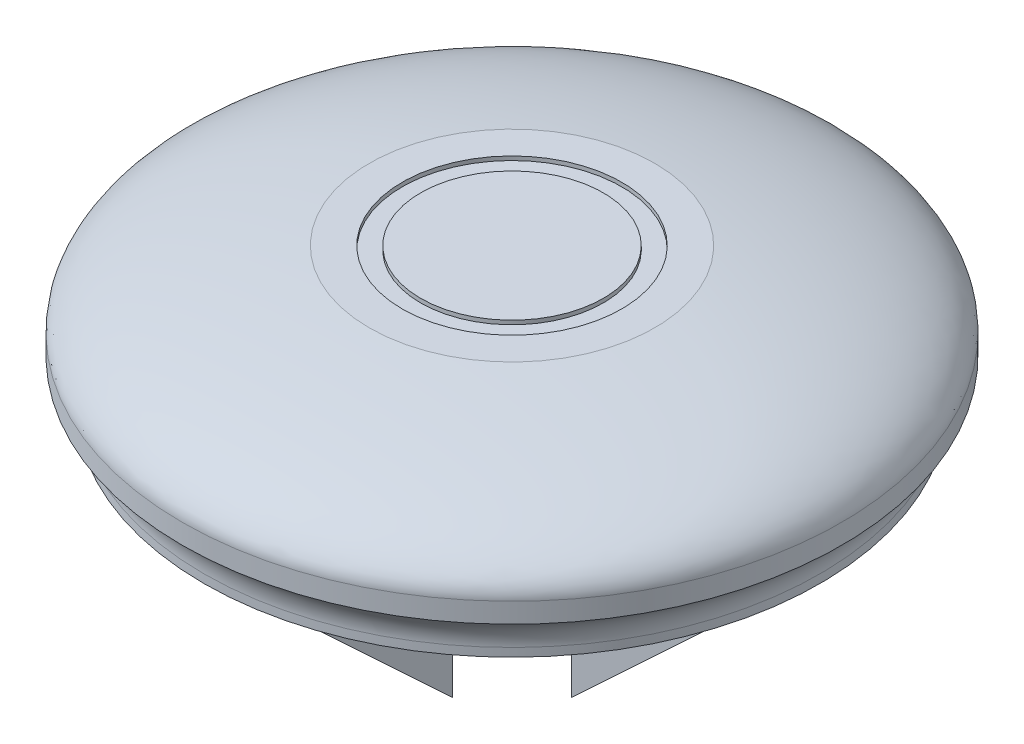
ISO-10303-21;
HEADER;
FILE_DESCRIPTION(('STEP AP214'),'2;1');
FILE_NAME('part.step','',(''),(''),'','','');
FILE_SCHEMA(('AUTOMOTIVE_DESIGN { 1 0 10303 214 1 1 1 1 }'));
ENDSEC;
DATA;
#1=APPLICATION_CONTEXT('core data for automotive mechanical design processes');
#2=APPLICATION_PROTOCOL_DEFINITION('international standard','automotive_design',2000,#1);
#3=PRODUCT_CONTEXT('',#1,'mechanical');
#4=PRODUCT('Part','Part','',(#3));
#5=PRODUCT_RELATED_PRODUCT_CATEGORY('part','',(#4));
#6=PRODUCT_DEFINITION_FORMATION('','',#4);
#7=PRODUCT_DEFINITION_CONTEXT('part definition',#1,'design');
#8=PRODUCT_DEFINITION('design','',#6,#7);
#9=PRODUCT_DEFINITION_SHAPE('','',#8);
#10=(LENGTH_UNIT() NAMED_UNIT(*) SI_UNIT(.MILLI.,.METRE.));
#11=(NAMED_UNIT(*) PLANE_ANGLE_UNIT() SI_UNIT($,.RADIAN.));
#12=(NAMED_UNIT(*) SI_UNIT($,.STERADIAN.) SOLID_ANGLE_UNIT());
#13=UNCERTAINTY_MEASURE_WITH_UNIT(LENGTH_MEASURE(1.E-05),#10,'distance_accuracy_value','');
#14=(GEOMETRIC_REPRESENTATION_CONTEXT(3) GLOBAL_UNCERTAINTY_ASSIGNED_CONTEXT((#13)) GLOBAL_UNIT_ASSIGNED_CONTEXT((#10,
#11,#12)) REPRESENTATION_CONTEXT('',''));
#15=CARTESIAN_POINT('',(0.,0.,0.));
#16=DIRECTION('',(0.,0.,1.));
#17=DIRECTION('',(1.,0.,0.));
#18=AXIS2_PLACEMENT_3D('',#15,#16,#17);
#19=CARTESIAN_POINT('',(-49.9437478871734,-11.,23.4419821017126));
#20=DIRECTION('',(0.,-1.,0.));
#21=DIRECTION('',(0.,0.,-1.));
#22=AXIS2_PLACEMENT_3D('',#19,#20,#21);
#23=PLANE('',#22);
#24=CARTESIAN_POINT('',(-49.9437478871734,-11.,23.4419821017126));
#25=DIRECTION('',(0.,-1.,0.));
#26=DIRECTION('',(0.,0.,-1.));
#27=AXIS2_PLACEMENT_3D('',#24,#25,#26);
#28=CIRCLE('',#27,77.4335917291096);
#29=CARTESIAN_POINT('',(-49.9437478871734,-11.,100.875573830822));
#30=VERTEX_POINT('',#29);
#31=EDGE_CURVE('E195',#30,#30,#28,.T.);
#32=ORIENTED_EDGE('',*,*,#31,.T.);
#33=EDGE_LOOP('',(#32));
#34=FACE_BOUND('',#33,.T.);
#35=DIRECTION('',(1.,0.,0.));
#36=VECTOR('',#35,1.);
#37=CARTESIAN_POINT('',(-39.9437478871726,-11.,-50.8883616348798));
#38=LINE('',#37,#36);
#39=CARTESIAN_POINT('',(-59.9437478871726,-11.,-50.88836163488));
#40=VERTEX_POINT('',#39);
#41=CARTESIAN_POINT('',(-39.9437478871726,-11.,-50.8883616348798));
#42=VERTEX_POINT('',#41);
#43=EDGE_CURVE('E180',#40,#42,#38,.T.);
#44=ORIENTED_EDGE('',*,*,#43,.F.);
#45=CARTESIAN_POINT('',(-49.9437478871734,-11.,23.4419821017126));
#46=DIRECTION('',(0.,-1.,0.));
#47=DIRECTION('',(0.,0.,-1.));
#48=AXIS2_PLACEMENT_3D('',#45,#46,#47);
#49=CIRCLE('',#48,75.);
#50=CARTESIAN_POINT('',(-124.274091623766,-11.,13.4419821017126));
#51=VERTEX_POINT('',#50);
#52=EDGE_CURVE('E174',#51,#40,#49,.T.);
#53=ORIENTED_EDGE('',*,*,#52,.F.);
#54=DIRECTION('',(0.,0.,-1.));
#55=VECTOR('',#54,1.);
#56=CARTESIAN_POINT('',(-124.274091623766,-11.,13.4419821017126));
#57=LINE('',#56,#55);
#58=CARTESIAN_POINT('',(-124.274091623766,-11.,33.4419821017126));
#59=VERTEX_POINT('',#58);
#60=EDGE_CURVE('E143',#59,#51,#57,.T.);
#61=ORIENTED_EDGE('',*,*,#60,.F.);
#62=CARTESIAN_POINT('',(-49.9437478871734,-11.,23.4419821017126));
#63=DIRECTION('',(0.,-1.,0.));
#64=DIRECTION('',(0.,0.,-1.));
#65=AXIS2_PLACEMENT_3D('',#62,#63,#64);
#66=CIRCLE('',#65,75.);
#67=CARTESIAN_POINT('',(-59.9437478871736,-11.,97.7723258383051));
#68=VERTEX_POINT('',#67);
#69=EDGE_CURVE('E183',#68,#59,#66,.T.);
#70=ORIENTED_EDGE('',*,*,#69,.F.);
#71=DIRECTION('',(-1.,0.,0.));
#72=VECTOR('',#71,1.);
#73=CARTESIAN_POINT('',(-59.9437478871736,-11.,97.7723258383051));
#74=LINE('',#73,#72);
#75=CARTESIAN_POINT('',(-39.9437478871736,-11.,97.7723258383052));
#76=VERTEX_POINT('',#75);
#77=EDGE_CURVE('E399',#76,#68,#74,.T.);
#78=ORIENTED_EDGE('',*,*,#77,.F.);
#79=CARTESIAN_POINT('',(-49.9437478871734,-11.,23.4419821017126));
#80=DIRECTION('',(0.,-1.,0.));
#81=DIRECTION('',(0.,0.,-1.));
#82=AXIS2_PLACEMENT_3D('',#79,#80,#81);
#83=CIRCLE('',#82,75.);
#84=CARTESIAN_POINT('',(24.3865958494191,-11.,33.4419821017126));
#85=VERTEX_POINT('',#84);
#86=EDGE_CURVE('E186',#85,#76,#83,.T.);
#87=ORIENTED_EDGE('',*,*,#86,.F.);
#88=DIRECTION('',(0.,0.,1.));
#89=VECTOR('',#88,1.);
#90=CARTESIAN_POINT('',(24.3865958494191,-11.,33.4419821017126));
#91=LINE('',#90,#89);
#92=CARTESIAN_POINT('',(24.3865958494191,-11.,13.4419821017126));
#93=VERTEX_POINT('',#92);
#94=EDGE_CURVE('E408',#93,#85,#91,.T.);
#95=ORIENTED_EDGE('',*,*,#94,.F.);
#96=CARTESIAN_POINT('',(-49.9437478871734,-11.,23.4419821017126));
#97=DIRECTION('',(0.,-1.,0.));
#98=DIRECTION('',(0.,0.,-1.));
#99=AXIS2_PLACEMENT_3D('',#96,#97,#98);
#100=CIRCLE('',#99,75.);
#101=EDGE_CURVE('E182',#42,#93,#100,.T.);
#102=ORIENTED_EDGE('',*,*,#101,.F.);
#103=EDGE_LOOP('',(#44,#53,#61,#70,#78,#87,#95,#102));
#104=FACE_BOUND('',#103,.T.);
#105=ADVANCED_FACE('F33',(#34,#104),#23,.T.);
#106=CARTESIAN_POINT('',(-49.9437478871734,5.,23.4419821017126));
#107=DIRECTION('',(0.,-1.,0.));
#108=DIRECTION('',(0.,0.,-1.));
#109=AXIS2_PLACEMENT_3D('',#106,#107,#108);
#110=CYLINDRICAL_SURFACE('',#109,82.8321698610159);
#111=CARTESIAN_POINT('',(-49.9437478871734,5.,23.4419821017126));
#112=DIRECTION('',(0.,1.,0.));
#113=DIRECTION('',(0.,0.,1.));
#114=AXIS2_PLACEMENT_3D('',#111,#112,#113);
#115=CIRCLE('',#114,82.8321698610159);
#116=CARTESIAN_POINT('',(-49.9437478871734,5.,106.274151962729));
#117=VERTEX_POINT('',#116);
#118=EDGE_CURVE('E41',#117,#117,#115,.T.);
#119=ORIENTED_EDGE('',*,*,#118,.F.);
#120=EDGE_LOOP('',(#119));
#121=FACE_BOUND('',#120,.T.);
#122=CARTESIAN_POINT('',(-49.9437478871734,0.,23.4419821017126));
#123=DIRECTION('',(0.,1.,0.));
#124=DIRECTION('',(0.,0.,1.));
#125=AXIS2_PLACEMENT_3D('',#122,#123,#124);
#126=CIRCLE('',#125,82.8321698610159);
#127=CARTESIAN_POINT('',(-49.9437478871734,0.,106.274151962729));
#128=VERTEX_POINT('',#127);
#129=EDGE_CURVE('E298',#128,#128,#126,.T.);
#130=ORIENTED_EDGE('',*,*,#129,.T.);
#131=EDGE_LOOP('',(#130));
#132=FACE_BOUND('',#131,.T.);
#133=ADVANCED_FACE('F220',(#121,#132),#110,.T.);
#134=CARTESIAN_POINT('',(-49.9437478871734,5.,23.4419821017126));
#135=DIRECTION('',(0.,0.,1.));
#136=DIRECTION('',(1.,0.,0.));
#137=AXIS2_PLACEMENT_3D('',#134,#135,#136);
#138=ELLIPSE('',#137,82.8321698610159,20.9109413690646);
#139=TRIMMED_CURVE('',#138,(PARAMETER_VALUE(-1.5707963267949)),
(PARAMETER_VALUE(1.5707963267949)),.T.,.PARAMETER.);
#140=CARTESIAN_POINT('',(-49.9437478871734,5.,23.4419821017126));
#141=DIRECTION('',(0.,-1.,0.));
#142=AXIS1_PLACEMENT('',#140,#141);
#143=SURFACE_OF_REVOLUTION('',#139,#142);
#144=CARTESIAN_POINT('',(-49.9437478871734,23.850888377349,23.4419821017126));
#145=DIRECTION('',(0.,-1.,0.));
#146=DIRECTION('',(0.,0.,-1.));
#147=AXIS2_PLACEMENT_3D('',#144,#145,#146);
#148=CIRCLE('',#147,35.8507157476907);
#149=CARTESIAN_POINT('',(-49.9437478871734,23.850888377349,-12.4087336459781));
#150=VERTEX_POINT('',#149);
#151=EDGE_CURVE('E208',#150,#150,#148,.F.);
#152=ORIENTED_EDGE('',*,*,#151,.F.);
#153=EDGE_LOOP('',(#152));
#154=FACE_BOUND('',#153,.T.);
#155=ORIENTED_EDGE('',*,*,#118,.T.);
#156=EDGE_LOOP('',(#155));
#157=FACE_BOUND('',#156,.T.);
#158=ADVANCED_FACE('F215',(#154,#157),#143,.F.);
#159=CARTESIAN_POINT('',(-96.5273513238363,23.850888377349,-51.5580178982874));
#160=DIRECTION('',(0.,-1.,0.));
#161=DIRECTION('',(0.,0.,-1.));
#162=AXIS2_PLACEMENT_3D('',#159,#160,#161);
#163=PLANE('',#162);
#164=CARTESIAN_POINT('',(-49.9437478871734,23.850888377349,23.4419821017126));
#165=DIRECTION('',(0.,1.,0.));
#166=DIRECTION('',(0.,0.,1.));
#167=AXIS2_PLACEMENT_3D('',#164,#165,#166);
#168=CIRCLE('',#167,27.5983496815975);
#169=CARTESIAN_POINT('',(-49.9437478871734,23.850888377349,51.0403317833101));
#170=VERTEX_POINT('',#169);
#171=EDGE_CURVE('E202',#170,#170,#168,.T.);
#172=ORIENTED_EDGE('',*,*,#171,.F.);
#173=EDGE_LOOP('',(#172));
#174=FACE_BOUND('',#173,.T.);
#175=ORIENTED_EDGE('',*,*,#151,.T.);
#176=EDGE_LOOP('',(#175));
#177=FACE_BOUND('',#176,.T.);
#178=ADVANCED_FACE('F219',(#174,#177),#163,.F.);
#179=CARTESIAN_POINT('',(-49.9437478871734,22.850888377349,23.4419821017126));
#180=DIRECTION('',(0.,1.,0.));
#181=DIRECTION('',(0.,0.,1.));
#182=AXIS2_PLACEMENT_3D('',#179,#180,#181);
#183=CYLINDRICAL_SURFACE('',#182,27.5983496815975);
#184=CARTESIAN_POINT('',(-49.9437478871734,22.850888377349,23.4419821017126));
#185=DIRECTION('',(0.,1.,0.));
#186=DIRECTION('',(0.,0.,1.));
#187=AXIS2_PLACEMENT_3D('',#184,#185,#186);
#188=CIRCLE('',#187,27.5983496815975);
#189=CARTESIAN_POINT('',(-49.9437478871734,22.850888377349,51.0403317833101));
#190=VERTEX_POINT('',#189);
#191=EDGE_CURVE('E205',#190,#190,#188,.T.);
#192=ORIENTED_EDGE('',*,*,#191,.F.);
#193=EDGE_LOOP('',(#192));
#194=FACE_BOUND('',#193,.T.);
#195=ORIENTED_EDGE('',*,*,#171,.T.);
#196=EDGE_LOOP('',(#195));
#197=FACE_BOUND('',#196,.T.);
#198=ADVANCED_FACE('F451',(#194,#197),#183,.F.);
#199=CARTESIAN_POINT('',(-49.9437478871734,22.850888377349,23.4419821017126));
#200=DIRECTION('',(0.,1.,0.));
#201=DIRECTION('',(0.,0.,1.));
#202=AXIS2_PLACEMENT_3D('',#199,#200,#201);
#203=PLANE('',#202);
#204=CARTESIAN_POINT('',(-49.9437478871734,22.850888377349,23.4419821017126));
#205=DIRECTION('',(0.,1.,0.));
#206=DIRECTION('',(0.,0.,1.));
#207=AXIS2_PLACEMENT_3D('',#204,#205,#206);
#208=CIRCLE('',#207,22.9729279472515);
#209=CARTESIAN_POINT('',(-49.9437478871734,22.850888377349,46.4149100489641));
#210=VERTEX_POINT('',#209);
#211=EDGE_CURVE('E199',#210,#210,#208,.T.);
#212=ORIENTED_EDGE('',*,*,#211,.F.);
#213=EDGE_LOOP('',(#212));
#214=FACE_BOUND('',#213,.T.);
#215=ORIENTED_EDGE('',*,*,#191,.T.);
#216=EDGE_LOOP('',(#215));
#217=FACE_BOUND('',#216,.T.);
#218=ADVANCED_FACE('F448',(#214,#217),#203,.T.);
#219=CARTESIAN_POINT('',(-49.9437478871734,22.850888377349,23.4419821017126));
#220=DIRECTION('',(0.,1.,0.));
#221=DIRECTION('',(0.,0.,1.));
#222=AXIS2_PLACEMENT_3D('',#219,#220,#221);
#223=CYLINDRICAL_SURFACE('',#222,22.9729279472515);
#224=ORIENTED_EDGE('',*,*,#211,.T.);
#225=EDGE_LOOP('',(#224));
#226=FACE_BOUND('',#225,.T.);
#227=CARTESIAN_POINT('',(-49.9437478871734,23.850888377349,23.4419821017126));
#228=DIRECTION('',(0.,1.,0.));
#229=DIRECTION('',(0.,0.,1.));
#230=AXIS2_PLACEMENT_3D('',#227,#228,#229);
#231=CIRCLE('',#230,22.9729279472515);
#232=CARTESIAN_POINT('',(-49.9437478871734,23.850888377349,46.4149100489641));
#233=VERTEX_POINT('',#232);
#234=EDGE_CURVE('E198',#233,#233,#231,.T.);
#235=ORIENTED_EDGE('',*,*,#234,.F.);
#236=EDGE_LOOP('',(#235));
#237=FACE_BOUND('',#236,.T.);
#238=ADVANCED_FACE('F445',(#226,#237),#223,.T.);
#239=ORIENTED_EDGE('',*,*,#234,.T.);
#240=EDGE_LOOP('',(#239));
#241=FACE_BOUND('',#240,.T.);
#242=ADVANCED_FACE('F443',(#241),#163,.F.);
#243=CARTESIAN_POINT('',(-49.9437478871734,-11.,23.4419821017126));
#244=DIRECTION('',(0.,1.,0.));
#245=DIRECTION('',(0.,0.,1.));
#246=AXIS2_PLACEMENT_3D('',#243,#244,#245);
#247=CYLINDRICAL_SURFACE('',#246,77.4335917291096);
#248=CARTESIAN_POINT('',(-49.9437478871734,-8.87845238720293,23.4419821017126));
#249=DIRECTION('',(0.,1.,0.));
#250=DIRECTION('',(0.,0.,1.));
#251=AXIS2_PLACEMENT_3D('',#248,#249,#250);
#252=CIRCLE('',#251,77.4335917291096);
#253=CARTESIAN_POINT('',(-49.9437478871734,-8.87845238720293,100.875573830822));
#254=VERTEX_POINT('',#253);
#255=EDGE_CURVE('E11',#254,#254,#252,.F.);
#256=CARTESIAN_POINT('',(-49.9437478871734,-8.87845238720293,100.875573830822));
#257=CARTESIAN_POINT('',(-49.9437478871734,-8.9005518415029,100.875573830822));
#258=CARTESIAN_POINT('',(-49.9437478871734,-8.92265129580286,100.875573830822));
#259=CARTESIAN_POINT('',(-49.9437478871734,-8.9668502044028,100.875573830822));
#260=CARTESIAN_POINT('',(-49.9437478871734,-8.98894965870277,100.875573830822));
#261=CARTESIAN_POINT('',(-49.9437478871734,-9.03314856730271,100.875573830822));
#262=CARTESIAN_POINT('',(-49.9437478871734,-9.05524802160268,100.875573830822));
#263=CARTESIAN_POINT('',(-49.9437478871734,-9.09944693020262,100.875573830822));
#264=CARTESIAN_POINT('',(-49.9437478871734,-9.12154638450259,100.875573830822));
#265=CARTESIAN_POINT('',(-49.9437478871734,-9.16574529310253,100.875573830822));
#266=CARTESIAN_POINT('',(-49.9437478871734,-9.1878447474025,100.875573830822));
#267=CARTESIAN_POINT('',(-49.9437478871734,-9.23204365600244,100.875573830822));
#268=CARTESIAN_POINT('',(-49.9437478871734,-9.25414311030241,100.875573830822));
#269=CARTESIAN_POINT('',(-49.9437478871734,-9.29834201890235,100.875573830822));
#270=CARTESIAN_POINT('',(-49.9437478871734,-9.32044147320232,100.875573830822));
#271=CARTESIAN_POINT('',(-49.9437478871734,-9.36464038180226,100.875573830822));
#272=CARTESIAN_POINT('',(-49.9437478871734,-9.38673983610223,100.875573830822));
#273=CARTESIAN_POINT('',(-49.9437478871734,-9.43093874470217,100.875573830822));
#274=CARTESIAN_POINT('',(-49.9437478871734,-9.45303819900214,100.875573830822));
#275=CARTESIAN_POINT('',(-49.9437478871734,-9.49723710760208,100.875573830822));
#276=CARTESIAN_POINT('',(-49.9437478871734,-9.51933656190205,100.875573830822));
#277=CARTESIAN_POINT('',(-49.9437478871734,-9.56353547050199,100.875573830822));
#278=CARTESIAN_POINT('',(-49.9437478871734,-9.58563492480195,100.875573830822));
#279=CARTESIAN_POINT('',(-49.9437478871734,-9.62983383340189,100.875573830822));
#280=CARTESIAN_POINT('',(-49.9437478871734,-9.65193328770186,100.875573830822));
#281=CARTESIAN_POINT('',(-49.9437478871734,-9.6961321963018,100.875573830822));
#282=CARTESIAN_POINT('',(-49.9437478871734,-9.71823165060177,100.875573830822));
#283=CARTESIAN_POINT('',(-49.9437478871734,-9.76243055920171,100.875573830822));
#284=CARTESIAN_POINT('',(-49.9437478871734,-9.78453001350168,100.875573830822));
#285=CARTESIAN_POINT('',(-49.9437478871734,-9.82872892210162,100.875573830822));
#286=CARTESIAN_POINT('',(-49.9437478871734,-9.85082837640159,100.875573830822));
#287=CARTESIAN_POINT('',(-49.9437478871734,-9.89502728500153,100.875573830822));
#288=CARTESIAN_POINT('',(-49.9437478871734,-9.9171267393015,100.875573830822));
#289=CARTESIAN_POINT('',(-49.9437478871734,-9.96132564790144,100.875573830822));
#290=CARTESIAN_POINT('',(-49.9437478871734,-9.98342510220141,100.875573830822));
#291=CARTESIAN_POINT('',(-49.9437478871734,-10.0276240108013,100.875573830822));
#292=CARTESIAN_POINT('',(-49.9437478871734,-10.0497234651013,100.875573830822));
#293=CARTESIAN_POINT('',(-49.9437478871734,-10.0939223737013,100.875573830822));
#294=CARTESIAN_POINT('',(-49.9437478871734,-10.1160218280012,100.875573830822));
#295=CARTESIAN_POINT('',(-49.9437478871734,-10.1602207366012,100.875573830822));
#296=CARTESIAN_POINT('',(-49.9437478871734,-10.1823201909011,100.875573830822));
#297=CARTESIAN_POINT('',(-49.9437478871734,-10.2265190995011,100.875573830822));
#298=CARTESIAN_POINT('',(-49.9437478871734,-10.248618553801,100.875573830822));
#299=CARTESIAN_POINT('',(-49.9437478871734,-10.292817462401,100.875573830822));
#300=CARTESIAN_POINT('',(-49.9437478871734,-10.314916916701,100.875573830822));
#301=CARTESIAN_POINT('',(-49.9437478871734,-10.3591158253009,100.875573830822));
#302=CARTESIAN_POINT('',(-49.9437478871734,-10.3812152796009,100.875573830822));
#303=CARTESIAN_POINT('',(-49.9437478871734,-10.4254141882008,100.875573830822));
#304=CARTESIAN_POINT('',(-49.9437478871734,-10.4475136425008,100.875573830822));
#305=CARTESIAN_POINT('',(-49.9437478871734,-10.4917125511007,100.875573830822));
#306=CARTESIAN_POINT('',(-49.9437478871734,-10.5138120054007,100.875573830822));
#307=CARTESIAN_POINT('',(-49.9437478871734,-10.5580109140006,100.875573830822));
#308=CARTESIAN_POINT('',(-49.9437478871734,-10.5801103683006,100.875573830822));
#309=CARTESIAN_POINT('',(-49.9437478871734,-10.6243092769005,100.875573830822));
#310=CARTESIAN_POINT('',(-49.9437478871734,-10.6464087312005,100.875573830822));
#311=CARTESIAN_POINT('',(-49.9437478871734,-10.6906076398004,100.875573830822));
#312=CARTESIAN_POINT('',(-49.9437478871734,-10.7127070941004,100.875573830822));
#313=CARTESIAN_POINT('',(-49.9437478871734,-10.7569060027003,100.875573830822));
#314=CARTESIAN_POINT('',(-49.9437478871734,-10.7790054570003,100.875573830822));
#315=CARTESIAN_POINT('',(-49.9437478871734,-10.8232043656003,100.875573830822));
#316=CARTESIAN_POINT('',(-49.9437478871734,-10.8453038199002,100.875573830822));
#317=CARTESIAN_POINT('',(-49.9437478871734,-10.8895027285002,100.875573830822));
#318=CARTESIAN_POINT('',(-49.9437478871734,-10.9116021828001,100.875573830822));
#319=CARTESIAN_POINT('',(-49.9437478871734,-10.9558010914001,100.875573830822));
#320=CARTESIAN_POINT('',(-49.9437478871734,-10.9779005457,100.875573830822));
#321=CARTESIAN_POINT('',(-49.9437478871734,-11.,100.875573830822));
#322=B_SPLINE_CURVE_WITH_KNOTS('',3,(#256,#257,#258,#259,#260,#261,#262,#263,#264,#265,#266,
#267,#268,#269,#270,#271,#272,#273,#274,#275,#276,#277,#278,#279,#280,#281,#282,#283,#284,#285,
#286,#287,#288,#289,#290,#291,#292,#293,#294,#295,#296,#297,#298,#299,#300,#301,#302,#303,#304,
#305,#306,#307,#308,#309,#310,#311,#312,#313,#314,#315,#316,#317,#318,#319,#320,#321),
.UNSPECIFIED.,.F.,.F.,(4,2,2,2,2,2,2,2,2,2,2,2,2,2,2,2,2,2,2,2,2,2,2,2,2,2,2,2,2,2,2,2,4),(0.,
0.0662983628999091,0.132596725799817,0.198895088699726,0.265193451599635,0.331491814499544,
0.397790177399453,0.464088540299362,0.530386903199271,0.59668526609918,0.66298362899909,
0.729281991898999,0.795580354798908,0.861878717698815,0.928177080598724,0.994475443498633,
1.06077380639854,1.12707216929845,1.19337053219836,1.25966889509827,1.32596725799818,
1.39226562089809,1.458563983798,1.5248623466979,1.59116070959781,1.65745907249772,
1.72375743539763,1.79005579829754,1.85635416119745,1.92265252409736,1.98895088699727,
2.05524924989718,2.12154761279709),.UNSPECIFIED.);
#323=EDGE_CURVE('BSEAM227',#254,#30,#322,.T.);
#324=ORIENTED_EDGE('',*,*,#255,.T.);
#325=ORIENTED_EDGE('',*,*,#31,.F.);
#326=ORIENTED_EDGE('',*,*,#323,.T.);
#327=ORIENTED_EDGE('',*,*,#323,.F.);
#328=EDGE_LOOP('',(#324,#326,#325,#327));
#329=FACE_BOUND('',#328,.T.);
#330=ADVANCED_FACE('F227',(#329),#247,.T.);
#331=CARTESIAN_POINT('',(-49.9437478871734,5.,23.4419821017126));
#332=DIRECTION('',(0.,-1.,0.));
#333=DIRECTION('',(0.,0.,-1.));
#334=AXIS2_PLACEMENT_3D('',#331,#332,#333);
#335=PLANE('',#334);
#336=DIRECTION('',(-1.,0.,0.));
#337=VECTOR('',#336,1.);
#338=CARTESIAN_POINT('',(-59.9437478871734,5.,-1.5580178982874));
#339=LINE('',#338,#337);
#340=CARTESIAN_POINT('',(-39.9437478871734,5.,-1.5580178982874));
#341=VERTEX_POINT('',#340);
#342=CARTESIAN_POINT('',(-59.9437478871734,5.,-1.5580178982874));
#343=VERTEX_POINT('',#342);
#344=EDGE_CURVE('E53',#341,#343,#339,.T.);
#345=ORIENTED_EDGE('',*,*,#344,.F.);
#346=DIRECTION('',(0.,0.,1.));
#347=VECTOR('',#346,1.);
#348=CARTESIAN_POINT('',(-39.9437478871734,5.,-50.8883616348799));
#349=LINE('',#348,#347);
#350=CARTESIAN_POINT('',(-39.9437478871734,5.,-50.8883616348799));
#351=VERTEX_POINT('',#350);
#352=EDGE_CURVE('E48',#351,#341,#349,.T.);
#353=ORIENTED_EDGE('',*,*,#352,.F.);
#354=CARTESIAN_POINT('',(-49.9437478871734,5.,23.4419821017126));
#355=DIRECTION('',(0.,1.,0.));
#356=DIRECTION('',(0.,0.,1.));
#357=AXIS2_PLACEMENT_3D('',#354,#355,#356);
#358=CIRCLE('',#357,75.);
#359=CARTESIAN_POINT('',(24.3865958494191,5.,13.4419821017126));
#360=VERTEX_POINT('',#359);
#361=EDGE_CURVE('E350',#360,#351,#358,.T.);
#362=ORIENTED_EDGE('',*,*,#361,.F.);
#363=DIRECTION('',(1.,0.,0.));
#364=VECTOR('',#363,1.);
#365=CARTESIAN_POINT('',(24.3865958494191,5.,13.4419821017126));
#366=LINE('',#365,#364);
#367=CARTESIAN_POINT('',(-24.9437478871734,5.,13.4419821017126));
#368=VERTEX_POINT('',#367);
#369=EDGE_CURVE('E347',#368,#360,#366,.T.);
#370=ORIENTED_EDGE('',*,*,#369,.F.);
#371=DIRECTION('',(0.,0.,-1.));
#372=VECTOR('',#371,1.);
#373=CARTESIAN_POINT('',(-24.9437478871734,5.,13.4419821017126));
#374=LINE('',#373,#372);
#375=CARTESIAN_POINT('',(-24.9437478871734,5.,33.4419821017126));
#376=VERTEX_POINT('',#375);
#377=EDGE_CURVE('E344',#376,#368,#374,.T.);
#378=ORIENTED_EDGE('',*,*,#377,.F.);
#379=DIRECTION('',(-1.,0.,0.));
#380=VECTOR('',#379,1.);
#381=CARTESIAN_POINT('',(24.3865958494191,5.,33.4419821017126));
#382=LINE('',#381,#380);
#383=CARTESIAN_POINT('',(24.3865958494192,5.,33.4419821017126));
#384=VERTEX_POINT('',#383);
#385=EDGE_CURVE('E341',#384,#376,#382,.T.);
#386=ORIENTED_EDGE('',*,*,#385,.F.);
#387=CARTESIAN_POINT('',(-49.9437478871734,5.,23.4419821017126));
#388=DIRECTION('',(0.,1.,0.));
#389=DIRECTION('',(0.,0.,1.));
#390=AXIS2_PLACEMENT_3D('',#387,#388,#389);
#391=CIRCLE('',#390,75.);
#392=CARTESIAN_POINT('',(-39.9437478871734,5.,97.7723258383051));
#393=VERTEX_POINT('',#392);
#394=EDGE_CURVE('E338',#393,#384,#391,.T.);
#395=ORIENTED_EDGE('',*,*,#394,.F.);
#396=DIRECTION('',(0.,0.,1.));
#397=VECTOR('',#396,1.);
#398=CARTESIAN_POINT('',(-39.9437478871734,5.,97.7723258383051));
#399=LINE('',#398,#397);
#400=CARTESIAN_POINT('',(-39.9437478871734,5.,48.4419821017126));
#401=VERTEX_POINT('',#400);
#402=EDGE_CURVE('E335',#401,#393,#399,.T.);
#403=ORIENTED_EDGE('',*,*,#402,.F.);
#404=DIRECTION('',(1.,0.,0.));
#405=VECTOR('',#404,1.);
#406=CARTESIAN_POINT('',(-39.9437478871734,5.,48.4419821017126));
#407=LINE('',#406,#405);
#408=CARTESIAN_POINT('',(-59.9437478871734,5.,48.4419821017126));
#409=VERTEX_POINT('',#408);
#410=EDGE_CURVE('E332',#409,#401,#407,.T.);
#411=ORIENTED_EDGE('',*,*,#410,.F.);
#412=DIRECTION('',(0.,0.,-1.));
#413=VECTOR('',#412,1.);
#414=CARTESIAN_POINT('',(-59.9437478871734,5.,97.7723258383051));
#415=LINE('',#414,#413);
#416=CARTESIAN_POINT('',(-59.9437478871734,5.,97.7723258383051));
#417=VERTEX_POINT('',#416);
#418=EDGE_CURVE('E329',#417,#409,#415,.T.);
#419=ORIENTED_EDGE('',*,*,#418,.F.);
#420=CARTESIAN_POINT('',(-49.9437478871734,5.,23.4419821017126));
#421=DIRECTION('',(0.,1.,0.));
#422=DIRECTION('',(0.,0.,1.));
#423=AXIS2_PLACEMENT_3D('',#420,#421,#422);
#424=CIRCLE('',#423,75.);
#425=CARTESIAN_POINT('',(-124.274091623766,5.,33.4419821017126));
#426=VERTEX_POINT('',#425);
#427=EDGE_CURVE('E326',#426,#417,#424,.T.);
#428=ORIENTED_EDGE('',*,*,#427,.F.);
#429=DIRECTION('',(-1.,0.,0.));
#430=VECTOR('',#429,1.);
#431=CARTESIAN_POINT('',(-124.274091623766,5.,33.4419821017126));
#432=LINE('',#431,#430);
#433=CARTESIAN_POINT('',(-74.9437478871734,5.,33.4419821017126));
#434=VERTEX_POINT('',#433);
#435=EDGE_CURVE('E323',#434,#426,#432,.T.);
#436=ORIENTED_EDGE('',*,*,#435,.F.);
#437=DIRECTION('',(0.,0.,1.));
#438=VECTOR('',#437,1.);
#439=CARTESIAN_POINT('',(-74.9437478871734,5.,33.4419821017126));
#440=LINE('',#439,#438);
#441=CARTESIAN_POINT('',(-74.9437478871734,5.,13.4419821017126));
#442=VERTEX_POINT('',#441);
#443=EDGE_CURVE('E320',#442,#434,#440,.T.);
#444=ORIENTED_EDGE('',*,*,#443,.F.);
#445=DIRECTION('',(1.,0.,0.));
#446=VECTOR('',#445,1.);
#447=CARTESIAN_POINT('',(-124.274091623766,5.,13.4419821017126));
#448=LINE('',#447,#446);
#449=CARTESIAN_POINT('',(-124.274091623766,5.,13.4419821017126));
#450=VERTEX_POINT('',#449);
#451=EDGE_CURVE('E318',#450,#442,#448,.T.);
#452=ORIENTED_EDGE('',*,*,#451,.F.);
#453=CARTESIAN_POINT('',(-49.9437478871734,5.,23.4419821017126));
#454=DIRECTION('',(0.,1.,0.));
#455=DIRECTION('',(0.,0.,1.));
#456=AXIS2_PLACEMENT_3D('',#453,#454,#455);
#457=CIRCLE('',#456,75.);
#458=CARTESIAN_POINT('',(-59.9437478871734,5.,-50.8883616348799));
#459=VERTEX_POINT('',#458);
#460=EDGE_CURVE('E175',#459,#450,#457,.T.);
#461=ORIENTED_EDGE('',*,*,#460,.F.);
#462=DIRECTION('',(0.,0.,-1.));
#463=VECTOR('',#462,1.);
#464=CARTESIAN_POINT('',(-59.9437478871734,5.,-50.8883616348799));
#465=LINE('',#464,#463);
#466=EDGE_CURVE('E311',#343,#459,#465,.T.);
#467=ORIENTED_EDGE('',*,*,#466,.F.);
#468=EDGE_LOOP('',(#345,#353,#362,#370,#378,#386,#395,#403,#411,#419,#428,#436,#444,#452,#461,#467));
#469=FACE_BOUND('',#468,.T.);
#470=ADVANCED_FACE('F223',(#469),#335,.T.);
#471=CARTESIAN_POINT('',(-49.9437478871734,5.,23.4419821017126));
#472=DIRECTION('',(0.,-1.,0.));
#473=DIRECTION('',(0.,0.,-1.));
#474=AXIS2_PLACEMENT_3D('',#471,#472,#473);
#475=CYLINDRICAL_SURFACE('',#474,75.);
#476=DIRECTION('',(0.,-1.,0.));
#477=VECTOR('',#476,1.);
#478=CARTESIAN_POINT('',(-39.9437478871734,5.,-50.8883616348799));
#479=LINE('',#478,#477);
#480=EDGE_CURVE('E352',#351,#42,#479,.T.);
#481=ORIENTED_EDGE('',*,*,#480,.T.);
#482=ORIENTED_EDGE('',*,*,#101,.T.);
#483=DIRECTION('',(0.,-1.,0.));
#484=VECTOR('',#483,1.);
#485=CARTESIAN_POINT('',(24.3865958494191,5.,13.4419821017126));
#486=LINE('',#485,#484);
#487=EDGE_CURVE('E355',#360,#93,#486,.T.);
#488=ORIENTED_EDGE('',*,*,#487,.F.);
#489=ORIENTED_EDGE('',*,*,#361,.T.);
#490=EDGE_LOOP('',(#481,#482,#488,#489));
#491=FACE_BOUND('',#490,.T.);
#492=ADVANCED_FACE('F226',(#491),#475,.F.);
#493=CARTESIAN_POINT('',(24.3865958494191,5.,13.4419821017126));
#494=DIRECTION('',(0.,0.,-1.));
#495=DIRECTION('',(-1.,0.,0.));
#496=AXIS2_PLACEMENT_3D('',#493,#494,#495);
#497=PLANE('',#496);
#498=DIRECTION('',(0.731363238981118,0.681988132350592,0.));
#499=VECTOR('',#498,1.);
#500=CARTESIAN_POINT('',(32.3670926401809,-3.55827499732724,13.4419821017126));
#501=LINE('',#500,#499);
#502=CARTESIAN_POINT('',(-24.9437478871734,-57.,13.4419821017126));
#503=VERTEX_POINT('',#502);
#504=EDGE_CURVE('E406',#503,#93,#501,.T.);
#505=ORIENTED_EDGE('',*,*,#504,.F.);
#506=DIRECTION('',(0.,-1.,0.));
#507=VECTOR('',#506,1.);
#508=CARTESIAN_POINT('',(-24.9437478871734,5.,13.4419821017126));
#509=LINE('',#508,#507);
#510=EDGE_CURVE('E358',#368,#503,#509,.T.);
#511=ORIENTED_EDGE('',*,*,#510,.F.);
#512=ORIENTED_EDGE('',*,*,#369,.T.);
#513=ORIENTED_EDGE('',*,*,#487,.T.);
#514=EDGE_LOOP('',(#505,#511,#512,#513));
#515=FACE_BOUND('',#514,.T.);
#516=ADVANCED_FACE('F230',(#515),#497,.T.);
#517=CARTESIAN_POINT('',(-24.9437478871734,5.,13.4419821017126));
#518=DIRECTION('',(-1.,0.,0.));
#519=DIRECTION('',(0.,0.,1.));
#520=AXIS2_PLACEMENT_3D('',#517,#518,#519);
#521=PLANE('',#520);
#522=ORIENTED_EDGE('',*,*,#510,.T.);
#523=DIRECTION('',(0.,0.,-1.));
#524=VECTOR('',#523,1.);
#525=CARTESIAN_POINT('',(-24.9437478871734,-57.,33.4419821017126));
#526=LINE('',#525,#524);
#527=CARTESIAN_POINT('',(-24.9437478871734,-57.,33.4419821017126));
#528=VERTEX_POINT('',#527);
#529=EDGE_CURVE('E189',#528,#503,#526,.T.);
#530=ORIENTED_EDGE('',*,*,#529,.F.);
#531=DIRECTION('',(0.,-1.,0.));
#532=VECTOR('',#531,1.);
#533=CARTESIAN_POINT('',(-24.9437478871734,5.,33.4419821017126));
#534=LINE('',#533,#532);
#535=EDGE_CURVE('E361',#376,#528,#534,.T.);
#536=ORIENTED_EDGE('',*,*,#535,.F.);
#537=ORIENTED_EDGE('',*,*,#377,.T.);
#538=EDGE_LOOP('',(#522,#530,#536,#537));
#539=FACE_BOUND('',#538,.T.);
#540=ADVANCED_FACE('F234',(#539),#521,.T.);
#541=CARTESIAN_POINT('',(24.3865958494191,5.,33.4419821017126));
#542=DIRECTION('',(0.,0.,1.));
#543=DIRECTION('',(1.,0.,0.));
#544=AXIS2_PLACEMENT_3D('',#541,#542,#543);
#545=PLANE('',#544);
#546=DIRECTION('',(-0.731363238981118,-0.681988132350592,0.));
#547=VECTOR('',#546,1.);
#548=CARTESIAN_POINT('',(24.3865958494191,-11.,33.4419821017126));
#549=LINE('',#548,#547);
#550=EDGE_CURVE('E403',#85,#528,#549,.T.);
#551=ORIENTED_EDGE('',*,*,#550,.F.);
#552=DIRECTION('',(0.,-1.,0.));
#553=VECTOR('',#552,1.);
#554=CARTESIAN_POINT('',(24.3865958494192,5.,33.4419821017126));
#555=LINE('',#554,#553);
#556=EDGE_CURVE('E364',#384,#85,#555,.T.);
#557=ORIENTED_EDGE('',*,*,#556,.F.);
#558=ORIENTED_EDGE('',*,*,#385,.T.);
#559=ORIENTED_EDGE('',*,*,#535,.T.);
#560=EDGE_LOOP('',(#551,#557,#558,#559));
#561=FACE_BOUND('',#560,.T.);
#562=ADVANCED_FACE('F238',(#561),#545,.T.);
#563=CARTESIAN_POINT('',(-49.9437478871734,5.,23.4419821017126));
#564=DIRECTION('',(0.,-1.,0.));
#565=DIRECTION('',(0.,0.,-1.));
#566=AXIS2_PLACEMENT_3D('',#563,#564,#565);
#567=CYLINDRICAL_SURFACE('',#566,75.);
#568=ORIENTED_EDGE('',*,*,#556,.T.);
#569=ORIENTED_EDGE('',*,*,#86,.T.);
#570=DIRECTION('',(0.,-1.,0.));
#571=VECTOR('',#570,1.);
#572=CARTESIAN_POINT('',(-39.9437478871734,5.,97.7723258383051));
#573=LINE('',#572,#571);
#574=EDGE_CURVE('E367',#393,#76,#573,.T.);
#575=ORIENTED_EDGE('',*,*,#574,.F.);
#576=ORIENTED_EDGE('',*,*,#394,.T.);
#577=EDGE_LOOP('',(#568,#569,#575,#576));
#578=FACE_BOUND('',#577,.T.);
#579=ADVANCED_FACE('F242',(#578),#567,.F.);
#580=CARTESIAN_POINT('',(-39.9437478871734,5.,97.7723258383051));
#581=DIRECTION('',(1.,0.,0.));
#582=DIRECTION('',(0.,0.,-1.));
#583=AXIS2_PLACEMENT_3D('',#580,#581,#582);
#584=PLANE('',#583);
#585=DIRECTION('',(0.,0.681988132350592,0.731363238981118));
#586=VECTOR('',#585,1.);
#587=CARTESIAN_POINT('',(-39.9437478871734,-3.55827499732725,105.752822629067));
#588=LINE('',#587,#586);
#589=CARTESIAN_POINT('',(-39.9437478871734,-57.,48.4419821017126));
#590=VERTEX_POINT('',#589);
#591=EDGE_CURVE('E391',#590,#76,#588,.T.);
#592=ORIENTED_EDGE('',*,*,#591,.F.);
#593=DIRECTION('',(0.,-1.,0.));
#594=VECTOR('',#593,1.);
#595=CARTESIAN_POINT('',(-39.9437478871734,5.,48.4419821017126));
#596=LINE('',#595,#594);
#597=EDGE_CURVE('E370',#401,#590,#596,.T.);
#598=ORIENTED_EDGE('',*,*,#597,.F.);
#599=ORIENTED_EDGE('',*,*,#402,.T.);
#600=ORIENTED_EDGE('',*,*,#574,.T.);
#601=EDGE_LOOP('',(#592,#598,#599,#600));
#602=FACE_BOUND('',#601,.T.);
#603=ADVANCED_FACE('F246',(#602),#584,.T.);
#604=CARTESIAN_POINT('',(-39.9437478871734,5.,48.4419821017126));
#605=DIRECTION('',(0.,0.,-1.));
#606=DIRECTION('',(-1.,0.,0.));
#607=AXIS2_PLACEMENT_3D('',#604,#605,#606);
#608=PLANE('',#607);
#609=ORIENTED_EDGE('',*,*,#597,.T.);
#610=DIRECTION('',(1.,0.,0.));
#611=VECTOR('',#610,1.);
#612=CARTESIAN_POINT('',(-59.9437478871734,-57.,48.4419821017126));
#613=LINE('',#612,#611);
#614=CARTESIAN_POINT('',(-59.9437478871734,-57.,48.4419821017126));
#615=VERTEX_POINT('',#614);
#616=EDGE_CURVE('E401',#615,#590,#613,.T.);
#617=ORIENTED_EDGE('',*,*,#616,.F.);
#618=DIRECTION('',(0.,-1.,0.));
#619=VECTOR('',#618,1.);
#620=CARTESIAN_POINT('',(-59.9437478871734,5.,48.4419821017126));
#621=LINE('',#620,#619);
#622=EDGE_CURVE('E373',#409,#615,#621,.T.);
#623=ORIENTED_EDGE('',*,*,#622,.F.);
#624=ORIENTED_EDGE('',*,*,#410,.T.);
#625=EDGE_LOOP('',(#609,#617,#623,#624));
#626=FACE_BOUND('',#625,.T.);
#627=ADVANCED_FACE('F250',(#626),#608,.T.);
#628=CARTESIAN_POINT('',(-59.9437478871734,5.,97.7723258383051));
#629=DIRECTION('',(-1.,0.,0.));
#630=DIRECTION('',(0.,0.,1.));
#631=AXIS2_PLACEMENT_3D('',#628,#629,#630);
#632=PLANE('',#631);
#633=DIRECTION('',(0.,-0.681988132350592,-0.731363238981118));
#634=VECTOR('',#633,1.);
#635=CARTESIAN_POINT('',(-59.9437478871736,-11.,97.7723258383051));
#636=LINE('',#635,#634);
#637=EDGE_CURVE('E166',#68,#615,#636,.T.);
#638=ORIENTED_EDGE('',*,*,#637,.F.);
#639=DIRECTION('',(0.,-1.,0.));
#640=VECTOR('',#639,1.);
#641=CARTESIAN_POINT('',(-59.9437478871734,5.,97.7723258383051));
#642=LINE('',#641,#640);
#643=EDGE_CURVE('E376',#417,#68,#642,.T.);
#644=ORIENTED_EDGE('',*,*,#643,.F.);
#645=ORIENTED_EDGE('',*,*,#418,.T.);
#646=ORIENTED_EDGE('',*,*,#622,.T.);
#647=EDGE_LOOP('',(#638,#644,#645,#646));
#648=FACE_BOUND('',#647,.T.);
#649=ADVANCED_FACE('F254',(#648),#632,.T.);
#650=CARTESIAN_POINT('',(-49.9437478871734,5.,23.4419821017126));
#651=DIRECTION('',(0.,-1.,0.));
#652=DIRECTION('',(0.,0.,-1.));
#653=AXIS2_PLACEMENT_3D('',#650,#651,#652);
#654=CYLINDRICAL_SURFACE('',#653,75.);
#655=ORIENTED_EDGE('',*,*,#643,.T.);
#656=ORIENTED_EDGE('',*,*,#69,.T.);
#657=DIRECTION('',(0.,-1.,0.));
#658=VECTOR('',#657,1.);
#659=CARTESIAN_POINT('',(-124.274091623766,5.,33.4419821017126));
#660=LINE('',#659,#658);
#661=EDGE_CURVE('E379',#426,#59,#660,.T.);
#662=ORIENTED_EDGE('',*,*,#661,.F.);
#663=ORIENTED_EDGE('',*,*,#427,.T.);
#664=EDGE_LOOP('',(#655,#656,#662,#663));
#665=FACE_BOUND('',#664,.T.);
#666=ADVANCED_FACE('F258',(#665),#654,.F.);
#667=CARTESIAN_POINT('',(-124.274091623766,5.,33.4419821017126));
#668=DIRECTION('',(0.,0.,1.));
#669=DIRECTION('',(1.,0.,0.));
#670=AXIS2_PLACEMENT_3D('',#667,#668,#669);
#671=PLANE('',#670);
#672=DIRECTION('',(-0.731363238981118,0.681988132350592,0.));
#673=VECTOR('',#672,1.);
#674=CARTESIAN_POINT('',(-132.254588414528,-3.55827499732722,33.4419821017126));
#675=LINE('',#674,#673);
#676=CARTESIAN_POINT('',(-74.9437478871734,-57.,33.4419821017126));
#677=VERTEX_POINT('',#676);
#678=EDGE_CURVE('E149',#677,#59,#675,.T.);
#679=ORIENTED_EDGE('',*,*,#678,.F.);
#680=DIRECTION('',(0.,-1.,0.));
#681=VECTOR('',#680,1.);
#682=CARTESIAN_POINT('',(-74.9437478871734,5.,33.4419821017126));
#683=LINE('',#682,#681);
#684=EDGE_CURVE('E381',#434,#677,#683,.T.);
#685=ORIENTED_EDGE('',*,*,#684,.F.);
#686=ORIENTED_EDGE('',*,*,#435,.T.);
#687=ORIENTED_EDGE('',*,*,#661,.T.);
#688=EDGE_LOOP('',(#679,#685,#686,#687));
#689=FACE_BOUND('',#688,.T.);
#690=ADVANCED_FACE('F262',(#689),#671,.T.);
#691=CARTESIAN_POINT('',(-74.9437478871734,5.,33.4419821017126));
#692=DIRECTION('',(1.,0.,0.));
#693=DIRECTION('',(0.,0.,-1.));
#694=AXIS2_PLACEMENT_3D('',#691,#692,#693);
#695=PLANE('',#694);
#696=ORIENTED_EDGE('',*,*,#684,.T.);
#697=DIRECTION('',(0.,0.,1.));
#698=VECTOR('',#697,1.);
#699=CARTESIAN_POINT('',(-74.9437478871734,-57.,13.4419821017126));
#700=LINE('',#699,#698);
#701=CARTESIAN_POINT('',(-74.9437478871734,-57.,13.4419821017126));
#702=VERTEX_POINT('',#701);
#703=EDGE_CURVE('E154',#702,#677,#700,.T.);
#704=ORIENTED_EDGE('',*,*,#703,.F.);
#705=DIRECTION('',(0.,-1.,0.));
#706=VECTOR('',#705,1.);
#707=CARTESIAN_POINT('',(-74.9437478871734,5.,13.4419821017126));
#708=LINE('',#707,#706);
#709=EDGE_CURVE('E164',#442,#702,#708,.T.);
#710=ORIENTED_EDGE('',*,*,#709,.F.);
#711=ORIENTED_EDGE('',*,*,#443,.T.);
#712=EDGE_LOOP('',(#696,#704,#710,#711));
#713=FACE_BOUND('',#712,.T.);
#714=ADVANCED_FACE('F266',(#713),#695,.T.);
#715=CARTESIAN_POINT('',(-124.274091623766,5.,13.4419821017126));
#716=DIRECTION('',(0.,0.,-1.));
#717=DIRECTION('',(-1.,0.,0.));
#718=AXIS2_PLACEMENT_3D('',#715,#716,#717);
#719=PLANE('',#718);
#720=DIRECTION('',(0.731363238981118,-0.681988132350592,0.));
#721=VECTOR('',#720,1.);
#722=CARTESIAN_POINT('',(-124.274091623766,-11.,13.4419821017126));
#723=LINE('',#722,#721);
#724=EDGE_CURVE('E146',#51,#702,#723,.T.);
#725=ORIENTED_EDGE('',*,*,#724,.F.);
#726=DIRECTION('',(0.,-1.,0.));
#727=VECTOR('',#726,1.);
#728=CARTESIAN_POINT('',(-124.274091623766,5.,13.4419821017126));
#729=LINE('',#728,#727);
#730=EDGE_CURVE('E162',#450,#51,#729,.T.);
#731=ORIENTED_EDGE('',*,*,#730,.F.);
#732=ORIENTED_EDGE('',*,*,#451,.T.);
#733=ORIENTED_EDGE('',*,*,#709,.T.);
#734=EDGE_LOOP('',(#725,#731,#732,#733));
#735=FACE_BOUND('',#734,.T.);
#736=ADVANCED_FACE('F160',(#735),#719,.T.);
#737=CARTESIAN_POINT('',(-49.9437478871734,5.,23.4419821017126));
#738=DIRECTION('',(0.,-1.,0.));
#739=DIRECTION('',(0.,0.,-1.));
#740=AXIS2_PLACEMENT_3D('',#737,#738,#739);
#741=CYLINDRICAL_SURFACE('',#740,75.);
#742=ORIENTED_EDGE('',*,*,#730,.T.);
#743=ORIENTED_EDGE('',*,*,#52,.T.);
#744=DIRECTION('',(0.,-1.,0.));
#745=VECTOR('',#744,1.);
#746=CARTESIAN_POINT('',(-59.9437478871734,5.,-50.8883616348799));
#747=LINE('',#746,#745);
#748=EDGE_CURVE('E176',#459,#40,#747,.T.);
#749=ORIENTED_EDGE('',*,*,#748,.F.);
#750=ORIENTED_EDGE('',*,*,#460,.T.);
#751=EDGE_LOOP('',(#742,#743,#749,#750));
#752=FACE_BOUND('',#751,.T.);
#753=ADVANCED_FACE('F172',(#752),#741,.F.);
#754=CARTESIAN_POINT('',(-59.9437478871734,5.,-50.8883616348799));
#755=DIRECTION('',(-1.,0.,0.));
#756=DIRECTION('',(0.,0.,1.));
#757=AXIS2_PLACEMENT_3D('',#754,#755,#756);
#758=PLANE('',#757);
#759=DIRECTION('',(0.,0.681988132350592,-0.731363238981118));
#760=VECTOR('',#759,1.);
#761=CARTESIAN_POINT('',(-59.9437478871734,-3.55827499732727,-58.8688584256418));
#762=LINE('',#761,#760);
#763=CARTESIAN_POINT('',(-59.9437478871731,-57.,-1.55801789828747));
#764=VERTEX_POINT('',#763);
#765=EDGE_CURVE('E388',#764,#40,#762,.T.);
#766=ORIENTED_EDGE('',*,*,#765,.F.);
#767=DIRECTION('',(0.,-1.,0.));
#768=VECTOR('',#767,1.);
#769=CARTESIAN_POINT('',(-59.9437478871734,5.,-1.5580178982874));
#770=LINE('',#769,#768);
#771=EDGE_CURVE('E304',#343,#764,#770,.T.);
#772=ORIENTED_EDGE('',*,*,#771,.F.);
#773=ORIENTED_EDGE('',*,*,#466,.T.);
#774=ORIENTED_EDGE('',*,*,#748,.T.);
#775=EDGE_LOOP('',(#766,#772,#773,#774));
#776=FACE_BOUND('',#775,.T.);
#777=ADVANCED_FACE('F275',(#776),#758,.T.);
#778=CARTESIAN_POINT('',(-59.9437478871734,5.,-1.5580178982874));
#779=DIRECTION('',(0.,0.,1.));
#780=DIRECTION('',(1.,0.,0.));
#781=AXIS2_PLACEMENT_3D('',#778,#779,#780);
#782=PLANE('',#781);
#783=ORIENTED_EDGE('',*,*,#771,.T.);
#784=DIRECTION('',(-1.,0.,0.));
#785=VECTOR('',#784,1.);
#786=CARTESIAN_POINT('',(-39.9437478871731,-57.,-1.55801789828726));
#787=LINE('',#786,#785);
#788=CARTESIAN_POINT('',(-39.9437478871731,-57.,-1.55801789828726));
#789=VERTEX_POINT('',#788);
#790=EDGE_CURVE('E155',#789,#764,#787,.T.);
#791=ORIENTED_EDGE('',*,*,#790,.F.);
#792=DIRECTION('',(0.,-1.,0.));
#793=VECTOR('',#792,1.);
#794=CARTESIAN_POINT('',(-39.9437478871734,5.,-1.5580178982874));
#795=LINE('',#794,#793);
#796=EDGE_CURVE('E300',#341,#789,#795,.T.);
#797=ORIENTED_EDGE('',*,*,#796,.F.);
#798=ORIENTED_EDGE('',*,*,#344,.T.);
#799=EDGE_LOOP('',(#783,#791,#797,#798));
#800=FACE_BOUND('',#799,.T.);
#801=ADVANCED_FACE('F278',(#800),#782,.T.);
#802=CARTESIAN_POINT('',(-39.9437478871734,5.,-50.8883616348799));
#803=DIRECTION('',(1.,0.,0.));
#804=DIRECTION('',(0.,0.,-1.));
#805=AXIS2_PLACEMENT_3D('',#802,#803,#804);
#806=PLANE('',#805);
#807=DIRECTION('',(0.,-0.681988132350592,0.731363238981118));
#808=VECTOR('',#807,1.);
#809=CARTESIAN_POINT('',(-39.9437478871726,-11.,-50.8883616348798));
#810=LINE('',#809,#808);
#811=EDGE_CURVE('E167',#42,#789,#810,.T.);
#812=ORIENTED_EDGE('',*,*,#811,.F.);
#813=ORIENTED_EDGE('',*,*,#480,.F.);
#814=ORIENTED_EDGE('',*,*,#352,.T.);
#815=ORIENTED_EDGE('',*,*,#796,.T.);
#816=EDGE_LOOP('',(#812,#813,#814,#815));
#817=FACE_BOUND('',#816,.T.);
#818=ADVANCED_FACE('F282',(#817),#806,.T.);
#819=CARTESIAN_POINT('',(-49.9437478871734,-8.87845238720293,23.4419821017126));
#820=DIRECTION('',(0.,1.,0.));
#821=DIRECTION('',(0.,0.,1.));
#822=AXIS2_PLACEMENT_3D('',#819,#820,#821);
#823=TOROIDAL_SURFACE('',#822,87.4335917291096,10.);
#824=ORIENTED_EDGE('',*,*,#129,.F.);
#825=EDGE_LOOP('',(#824));
#826=FACE_BOUND('',#825,.T.);
#827=ORIENTED_EDGE('',*,*,#255,.F.);
#828=EDGE_LOOP('',(#827));
#829=FACE_BOUND('',#828,.T.);
#830=ADVANCED_FACE('F35',(#826,#829),#823,.F.);
#831=CARTESIAN_POINT('',(24.3865958494191,-11.,-12.5580178982874));
#832=DIRECTION('',(-0.681988132350592,0.731363238981118,0.));
#833=DIRECTION('',(-0.731363238981118,-0.681988132350592,0.));
#834=AXIS2_PLACEMENT_3D('',#831,#832,#833);
#835=PLANE('',#834);
#836=ORIENTED_EDGE('',*,*,#504,.T.);
#837=ORIENTED_EDGE('',*,*,#94,.T.);
#838=ORIENTED_EDGE('',*,*,#550,.T.);
#839=ORIENTED_EDGE('',*,*,#529,.T.);
#840=EDGE_LOOP('',(#836,#837,#838,#839));
#841=FACE_BOUND('',#840,.T.);
#842=ADVANCED_FACE('F412',(#841),#835,.F.);
#843=CARTESIAN_POINT('',(-85.9437478871726,-11.,-50.8883616348803));
#844=DIRECTION('',(0.,0.731363238981118,0.681988132350592));
#845=DIRECTION('',(0.,-0.681988132350592,0.731363238981118));
#846=AXIS2_PLACEMENT_3D('',#843,#844,#845);
#847=PLANE('',#846);
#848=ORIENTED_EDGE('',*,*,#765,.T.);
#849=ORIENTED_EDGE('',*,*,#43,.T.);
#850=ORIENTED_EDGE('',*,*,#811,.T.);
#851=ORIENTED_EDGE('',*,*,#790,.T.);
#852=EDGE_LOOP('',(#848,#849,#850,#851));
#853=FACE_BOUND('',#852,.T.);
#854=ADVANCED_FACE('F435',(#853),#847,.F.);
#855=CARTESIAN_POINT('',(-124.274091623766,-11.,59.4419821017127));
#856=DIRECTION('',(0.681988132350592,0.731363238981118,0.));
#857=DIRECTION('',(-0.731363238981118,0.681988132350592,0.));
#858=AXIS2_PLACEMENT_3D('',#855,#856,#857);
#859=PLANE('',#858);
#860=ORIENTED_EDGE('',*,*,#678,.T.);
#861=ORIENTED_EDGE('',*,*,#60,.T.);
#862=ORIENTED_EDGE('',*,*,#724,.T.);
#863=ORIENTED_EDGE('',*,*,#703,.T.);
#864=EDGE_LOOP('',(#860,#861,#862,#863));
#865=FACE_BOUND('',#864,.T.);
#866=ADVANCED_FACE('F145',(#865),#859,.F.);
#867=CARTESIAN_POINT('',(-13.9437478871736,-11.,97.7723258383052));
#868=DIRECTION('',(0.,0.731363238981118,-0.681988132350592));
#869=DIRECTION('',(0.,0.681988132350592,0.731363238981118));
#870=AXIS2_PLACEMENT_3D('',#867,#868,#869);
#871=PLANE('',#870);
#872=ORIENTED_EDGE('',*,*,#591,.T.);
#873=ORIENTED_EDGE('',*,*,#77,.T.);
#874=ORIENTED_EDGE('',*,*,#637,.T.);
#875=ORIENTED_EDGE('',*,*,#616,.T.);
#876=EDGE_LOOP('',(#872,#873,#874,#875));
#877=FACE_BOUND('',#876,.T.);
#878=ADVANCED_FACE('F429',(#877),#871,.F.);
#879=CLOSED_SHELL('',(#105,#133,#158,#178,#198,#218,#238,#242,#330,#470,#492,#516,#540,#562,
#579,#603,#627,#649,#666,#690,#714,#736,#753,#777,#801,#818,#830,#842,#854,#866,#878));
#880=MANIFOLD_SOLID_BREP('B2',#879);
#881=ADVANCED_BREP_SHAPE_REPRESENTATION('',(#18,#880),#14);
#882=SHAPE_DEFINITION_REPRESENTATION(#9,#881);
ENDSEC;
END-ISO-10303-21;
